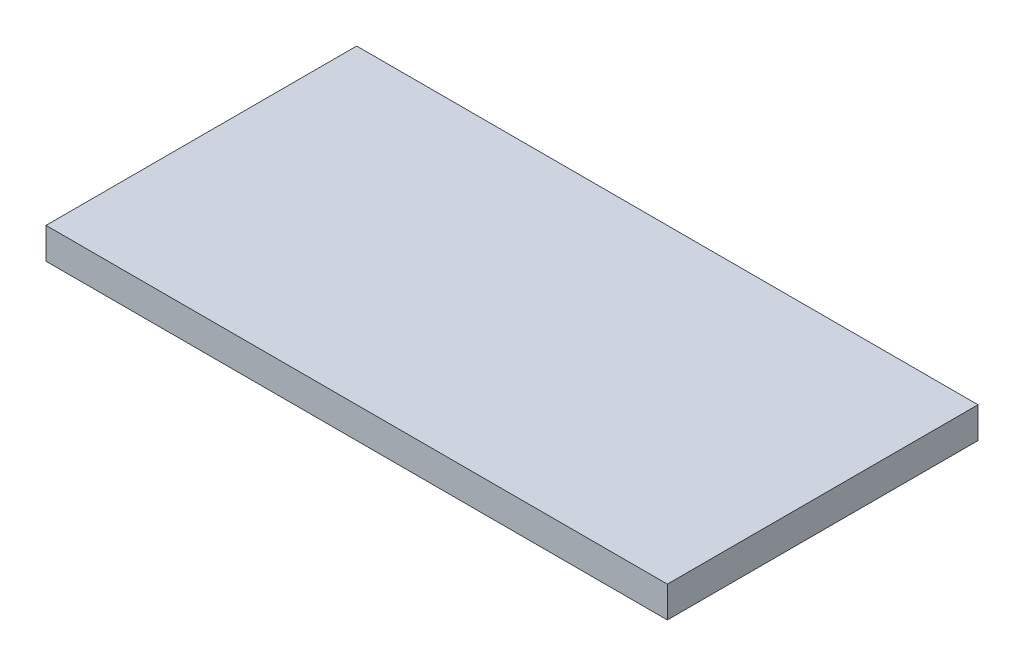
ISO-10303-21;
HEADER;
FILE_DESCRIPTION(('STEP AP214'),'2;1');
FILE_NAME('part.step','',(''),(''),'','','');
FILE_SCHEMA(('AUTOMOTIVE_DESIGN { 1 0 10303 214 1 1 1 1 }'));
ENDSEC;
DATA;
#1=APPLICATION_CONTEXT('core data for automotive mechanical design processes');
#2=APPLICATION_PROTOCOL_DEFINITION('international standard','automotive_design',2000,#1);
#3=PRODUCT_CONTEXT('',#1,'mechanical');
#4=PRODUCT('Part','Part','',(#3));
#5=PRODUCT_RELATED_PRODUCT_CATEGORY('part','',(#4));
#6=PRODUCT_DEFINITION_FORMATION('','',#4);
#7=PRODUCT_DEFINITION_CONTEXT('part definition',#1,'design');
#8=PRODUCT_DEFINITION('design','',#6,#7);
#9=PRODUCT_DEFINITION_SHAPE('','',#8);
#10=(LENGTH_UNIT() NAMED_UNIT(*) SI_UNIT(.MILLI.,.METRE.));
#11=(NAMED_UNIT(*) PLANE_ANGLE_UNIT() SI_UNIT($,.RADIAN.));
#12=(NAMED_UNIT(*) SI_UNIT($,.STERADIAN.) SOLID_ANGLE_UNIT());
#13=UNCERTAINTY_MEASURE_WITH_UNIT(LENGTH_MEASURE(1.E-05),#10,'distance_accuracy_value','');
#14=(GEOMETRIC_REPRESENTATION_CONTEXT(3) GLOBAL_UNCERTAINTY_ASSIGNED_CONTEXT((#13)) GLOBAL_UNIT_ASSIGNED_CONTEXT((#10,
#11,#12)) REPRESENTATION_CONTEXT('',''));
#15=CARTESIAN_POINT('',(0.,0.,0.));
#16=DIRECTION('',(0.,0.,1.));
#17=DIRECTION('',(1.,0.,0.));
#18=AXIS2_PLACEMENT_3D('',#15,#16,#17);
#19=CARTESIAN_POINT('',(1000.,100.,-500.));
#20=DIRECTION('',(-1.,0.,0.));
#21=DIRECTION('',(0.,0.,1.));
#22=AXIS2_PLACEMENT_3D('',#19,#20,#21);
#23=PLANE('',#22);
#24=DIRECTION('',(0.,0.,-1.));
#25=VECTOR('',#24,1.);
#26=CARTESIAN_POINT('',(1000.,0.,-500.));
#27=LINE('',#26,#25);
#28=CARTESIAN_POINT('',(1000.,0.,500.));
#29=VERTEX_POINT('',#28);
#30=CARTESIAN_POINT('',(1000.,0.,-500.));
#31=VERTEX_POINT('',#30);
#32=EDGE_CURVE('E97',#29,#31,#27,.T.);
#33=ORIENTED_EDGE('',*,*,#32,.T.);
#34=DIRECTION('',(0.,-1.,0.));
#35=VECTOR('',#34,1.);
#36=CARTESIAN_POINT('',(1000.,100.,-500.));
#37=LINE('',#36,#35);
#38=CARTESIAN_POINT('',(1000.,100.,-500.));
#39=VERTEX_POINT('',#38);
#40=EDGE_CURVE('E11',#39,#31,#37,.T.);
#41=ORIENTED_EDGE('',*,*,#40,.F.);
#42=DIRECTION('',(0.,0.,-1.));
#43=VECTOR('',#42,1.);
#44=CARTESIAN_POINT('',(1000.,100.,-500.));
#45=LINE('',#44,#43);
#46=CARTESIAN_POINT('',(1000.,100.,500.));
#47=VERTEX_POINT('',#46);
#48=EDGE_CURVE('E84',#47,#39,#45,.T.);
#49=ORIENTED_EDGE('',*,*,#48,.F.);
#50=DIRECTION('',(0.,-1.,0.));
#51=VECTOR('',#50,1.);
#52=CARTESIAN_POINT('',(1000.,100.,500.));
#53=LINE('',#52,#51);
#54=EDGE_CURVE('E93',#47,#29,#53,.T.);
#55=ORIENTED_EDGE('',*,*,#54,.T.);
#56=EDGE_LOOP('',(#33,#41,#49,#55));
#57=FACE_BOUND('',#56,.T.);
#58=ADVANCED_FACE('F32',(#57),#23,.F.);
#59=CARTESIAN_POINT('',(-1000.,100.,-500.));
#60=DIRECTION('',(0.,0.,1.));
#61=DIRECTION('',(1.,0.,0.));
#62=AXIS2_PLACEMENT_3D('',#59,#60,#61);
#63=PLANE('',#62);
#64=DIRECTION('',(-1.,0.,0.));
#65=VECTOR('',#64,1.);
#66=CARTESIAN_POINT('',(-1000.,0.,-500.));
#67=LINE('',#66,#65);
#68=CARTESIAN_POINT('',(-1000.,0.,-500.));
#69=VERTEX_POINT('',#68);
#70=EDGE_CURVE('E88',#31,#69,#67,.T.);
#71=ORIENTED_EDGE('',*,*,#70,.T.);
#72=DIRECTION('',(0.,-1.,0.));
#73=VECTOR('',#72,1.);
#74=CARTESIAN_POINT('',(-1000.,100.,-500.));
#75=LINE('',#74,#73);
#76=CARTESIAN_POINT('',(-1000.,100.,-500.));
#77=VERTEX_POINT('',#76);
#78=EDGE_CURVE('E41',#77,#69,#75,.T.);
#79=ORIENTED_EDGE('',*,*,#78,.F.);
#80=DIRECTION('',(-1.,0.,0.));
#81=VECTOR('',#80,1.);
#82=CARTESIAN_POINT('',(-1000.,100.,-500.));
#83=LINE('',#82,#81);
#84=EDGE_CURVE('E79',#39,#77,#83,.T.);
#85=ORIENTED_EDGE('',*,*,#84,.F.);
#86=ORIENTED_EDGE('',*,*,#40,.T.);
#87=EDGE_LOOP('',(#71,#79,#85,#86));
#88=FACE_BOUND('',#87,.T.);
#89=ADVANCED_FACE('F87',(#88),#63,.F.);
#90=CARTESIAN_POINT('',(-1000.,100.,-500.));
#91=DIRECTION('',(1.,0.,0.));
#92=DIRECTION('',(0.,0.,-1.));
#93=AXIS2_PLACEMENT_3D('',#90,#91,#92);
#94=PLANE('',#93);
#95=DIRECTION('',(0.,0.,1.));
#96=VECTOR('',#95,1.);
#97=CARTESIAN_POINT('',(-1000.,0.,-500.));
#98=LINE('',#97,#96);
#99=CARTESIAN_POINT('',(-1000.,0.,500.));
#100=VERTEX_POINT('',#99);
#101=EDGE_CURVE('E66',#69,#100,#98,.T.);
#102=ORIENTED_EDGE('',*,*,#101,.T.);
#103=DIRECTION('',(0.,-1.,0.));
#104=VECTOR('',#103,1.);
#105=CARTESIAN_POINT('',(-1000.,100.,500.));
#106=LINE('',#105,#104);
#107=CARTESIAN_POINT('',(-1000.,100.,500.));
#108=VERTEX_POINT('',#107);
#109=EDGE_CURVE('E89',#108,#100,#106,.T.);
#110=ORIENTED_EDGE('',*,*,#109,.F.);
#111=DIRECTION('',(0.,0.,1.));
#112=VECTOR('',#111,1.);
#113=CARTESIAN_POINT('',(-1000.,100.,-500.));
#114=LINE('',#113,#112);
#115=EDGE_CURVE('E82',#77,#108,#114,.T.);
#116=ORIENTED_EDGE('',*,*,#115,.F.);
#117=ORIENTED_EDGE('',*,*,#78,.T.);
#118=EDGE_LOOP('',(#102,#110,#116,#117));
#119=FACE_BOUND('',#118,.T.);
#120=ADVANCED_FACE('F91',(#119),#94,.F.);
#121=CARTESIAN_POINT('',(-1000.,100.,500.));
#122=DIRECTION('',(0.,0.,-1.));
#123=DIRECTION('',(-1.,0.,0.));
#124=AXIS2_PLACEMENT_3D('',#121,#122,#123);
#125=PLANE('',#124);
#126=DIRECTION('',(1.,0.,0.));
#127=VECTOR('',#126,1.);
#128=CARTESIAN_POINT('',(-1000.,0.,500.));
#129=LINE('',#128,#127);
#130=EDGE_CURVE('E72',#100,#29,#129,.T.);
#131=ORIENTED_EDGE('',*,*,#130,.T.);
#132=ORIENTED_EDGE('',*,*,#54,.F.);
#133=DIRECTION('',(1.,0.,0.));
#134=VECTOR('',#133,1.);
#135=CARTESIAN_POINT('',(-1000.,100.,500.));
#136=LINE('',#135,#134);
#137=EDGE_CURVE('E49',#108,#47,#136,.T.);
#138=ORIENTED_EDGE('',*,*,#137,.F.);
#139=ORIENTED_EDGE('',*,*,#109,.T.);
#140=EDGE_LOOP('',(#131,#132,#138,#139));
#141=FACE_BOUND('',#140,.T.);
#142=ADVANCED_FACE('F104',(#141),#125,.F.);
#143=CARTESIAN_POINT('',(0.,100.,0.));
#144=DIRECTION('',(0.,1.,0.));
#145=DIRECTION('',(0.,0.,1.));
#146=AXIS2_PLACEMENT_3D('',#143,#144,#145);
#147=PLANE('',#146);
#148=ORIENTED_EDGE('',*,*,#48,.T.);
#149=ORIENTED_EDGE('',*,*,#84,.T.);
#150=ORIENTED_EDGE('',*,*,#115,.T.);
#151=ORIENTED_EDGE('',*,*,#137,.T.);
#152=EDGE_LOOP('',(#148,#149,#150,#151));
#153=FACE_BOUND('',#152,.T.);
#154=ADVANCED_FACE('F80',(#153),#147,.T.);
#155=CARTESIAN_POINT('',(0.,0.,0.));
#156=DIRECTION('',(0.,1.,0.));
#157=DIRECTION('',(0.,0.,1.));
#158=AXIS2_PLACEMENT_3D('',#155,#156,#157);
#159=PLANE('',#158);
#160=CARTESIAN_POINT('',(-900.,0.,400.));
#161=DIRECTION('',(0.,1.,0.));
#162=DIRECTION('',(0.,0.,1.));
#163=AXIS2_PLACEMENT_3D('',#160,#161,#162);
#164=CIRCLE('',#163,63.8059390746642);
#165=CARTESIAN_POINT('',(-900.,0.,463.805939074664));
#166=VERTEX_POINT('',#165);
#167=EDGE_CURVE('E35',#166,#166,#164,.T.);
#168=ORIENTED_EDGE('',*,*,#167,.T.);
#169=EDGE_LOOP('',(#168));
#170=FACE_BOUND('',#169,.T.);
#171=ORIENTED_EDGE('',*,*,#32,.F.);
#172=ORIENTED_EDGE('',*,*,#130,.F.);
#173=ORIENTED_EDGE('',*,*,#101,.F.);
#174=ORIENTED_EDGE('',*,*,#70,.F.);
#175=EDGE_LOOP('',(#171,#172,#173,#174));
#176=FACE_BOUND('',#175,.T.);
#177=ADVANCED_FACE('F107',(#170,#176),#159,.F.);
#178=CARTESIAN_POINT('',(-900.,50.,400.));
#179=DIRECTION('',(0.,-1.,0.));
#180=DIRECTION('',(0.,0.,-1.));
#181=AXIS2_PLACEMENT_3D('',#178,#179,#180);
#182=CYLINDRICAL_SURFACE('',#181,63.8059390746642);
#183=CARTESIAN_POINT('',(-900.,50.,400.));
#184=DIRECTION('',(0.,-1.,0.));
#185=DIRECTION('',(0.,0.,-1.));
#186=AXIS2_PLACEMENT_3D('',#183,#184,#185);
#187=CIRCLE('',#186,63.8059390746642);
#188=CARTESIAN_POINT('',(-900.,50.,336.194060925336));
#189=VERTEX_POINT('',#188);
#190=EDGE_CURVE('E110',#189,#189,#187,.T.);
#191=ORIENTED_EDGE('',*,*,#190,.F.);
#192=EDGE_LOOP('',(#191));
#193=FACE_BOUND('',#192,.T.);
#194=ORIENTED_EDGE('',*,*,#167,.F.);
#195=EDGE_LOOP('',(#194));
#196=FACE_BOUND('',#195,.T.);
#197=ADVANCED_FACE('F118',(#193,#196),#182,.F.);
#198=CARTESIAN_POINT('',(-900.,50.,400.));
#199=DIRECTION('',(0.,-1.,0.));
#200=DIRECTION('',(0.,0.,-1.));
#201=AXIS2_PLACEMENT_3D('',#198,#199,#200);
#202=PLANE('',#201);
#203=ORIENTED_EDGE('',*,*,#190,.T.);
#204=EDGE_LOOP('',(#203));
#205=FACE_BOUND('',#204,.T.);
#206=ADVANCED_FACE('F120',(#205),#202,.T.);
#207=CLOSED_SHELL('',(#58,#89,#120,#142,#154,#177,#197,#206));
#208=MANIFOLD_SOLID_BREP('B2',#207);
#209=ADVANCED_BREP_SHAPE_REPRESENTATION('',(#18,#208),#14);
#210=SHAPE_DEFINITION_REPRESENTATION(#9,#209);
ENDSEC;
END-ISO-10303-21;
